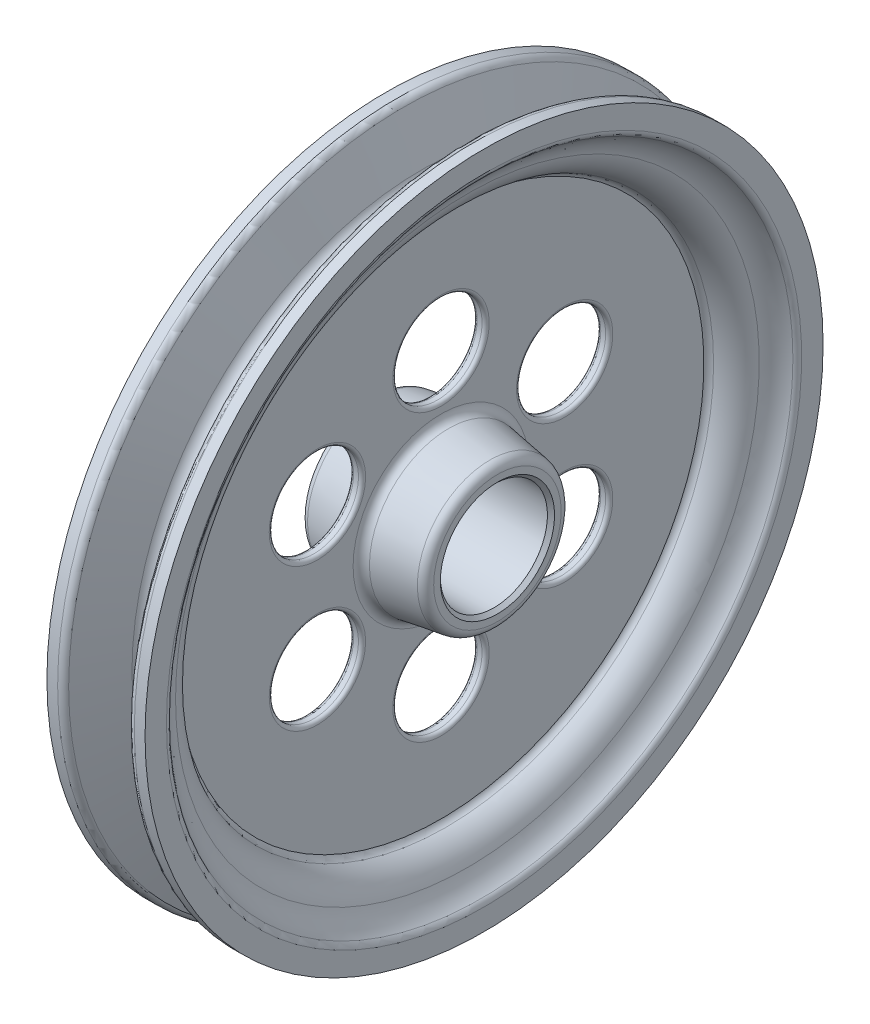
ISO-10303-21;
HEADER;
FILE_DESCRIPTION(('STEP AP214'),'2;1');
FILE_NAME('part.step','',(''),(''),'','','');
FILE_SCHEMA(('AUTOMOTIVE_DESIGN { 1 0 10303 214 1 1 1 1 }'));
ENDSEC;
DATA;
#1=APPLICATION_CONTEXT('core data for automotive mechanical design processes');
#2=APPLICATION_PROTOCOL_DEFINITION('international standard','automotive_design',2000,#1);
#3=PRODUCT_CONTEXT('',#1,'mechanical');
#4=PRODUCT('Part','Part','',(#3));
#5=PRODUCT_RELATED_PRODUCT_CATEGORY('part','',(#4));
#6=PRODUCT_DEFINITION_FORMATION('','',#4);
#7=PRODUCT_DEFINITION_CONTEXT('part definition',#1,'design');
#8=PRODUCT_DEFINITION('design','',#6,#7);
#9=PRODUCT_DEFINITION_SHAPE('','',#8);
#10=(LENGTH_UNIT() NAMED_UNIT(*) SI_UNIT(.MILLI.,.METRE.));
#11=(NAMED_UNIT(*) PLANE_ANGLE_UNIT() SI_UNIT($,.RADIAN.));
#12=(NAMED_UNIT(*) SI_UNIT($,.STERADIAN.) SOLID_ANGLE_UNIT());
#13=UNCERTAINTY_MEASURE_WITH_UNIT(LENGTH_MEASURE(1.E-05),#10,'distance_accuracy_value','');
#14=(GEOMETRIC_REPRESENTATION_CONTEXT(3) GLOBAL_UNCERTAINTY_ASSIGNED_CONTEXT((#13)) GLOBAL_UNIT_ASSIGNED_CONTEXT((#10,
#11,#12)) REPRESENTATION_CONTEXT('',''));
#15=CARTESIAN_POINT('',(0.,0.,0.));
#16=DIRECTION('',(0.,0.,1.));
#17=DIRECTION('',(1.,0.,0.));
#18=AXIS2_PLACEMENT_3D('',#15,#16,#17);
#19=CARTESIAN_POINT('',(3.375,49.2715916688331,0.));
#20=DIRECTION('',(-1.,0.,0.));
#21=DIRECTION('',(0.,0.,1.));
#22=AXIS2_PLACEMENT_3D('',#19,#20,#21);
#23=PLANE('',#22);
#24=CARTESIAN_POINT('',(3.375,40.0000000000039,-69.2820323027573));
#25=DIRECTION('',(-1.,0.,0.));
#26=DIRECTION('',(0.,0.,1.));
#27=AXIS2_PLACEMENT_3D('',#24,#25,#26);
#28=CIRCLE('',#27,27.0000000000012);
#29=CARTESIAN_POINT('',(3.375,40.0000000000039,-42.2820323027561));
#30=VERTEX_POINT('',#29);
#31=EDGE_CURVE('E87',#30,#30,#28,.T.);
#32=ORIENTED_EDGE('',*,*,#31,.T.);
#33=EDGE_LOOP('',(#32));
#34=FACE_BOUND('',#33,.T.);
#35=CARTESIAN_POINT('',(3.375,80.,0.));
#36=DIRECTION('',(-1.,0.,0.));
#37=DIRECTION('',(0.,0.,1.));
#38=AXIS2_PLACEMENT_3D('',#35,#36,#37);
#39=CIRCLE('',#38,27.);
#40=CARTESIAN_POINT('',(3.375,80.,27.));
#41=VERTEX_POINT('',#40);
#42=EDGE_CURVE('E90',#41,#41,#39,.T.);
#43=ORIENTED_EDGE('',*,*,#42,.T.);
#44=EDGE_LOOP('',(#43));
#45=FACE_BOUND('',#44,.T.);
#46=CARTESIAN_POINT('',(3.375,39.999999999996,69.2820323027529));
#47=DIRECTION('',(-1.,0.,0.));
#48=DIRECTION('',(0.,0.,1.));
#49=AXIS2_PLACEMENT_3D('',#46,#47,#48);
#50=CIRCLE('',#49,27.0000000000043);
#51=CARTESIAN_POINT('',(3.375,39.999999999996,96.2820323027571));
#52=VERTEX_POINT('',#51);
#53=EDGE_CURVE('E93',#52,#52,#50,.T.);
#54=ORIENTED_EDGE('',*,*,#53,.T.);
#55=EDGE_LOOP('',(#54));
#56=FACE_BOUND('',#55,.T.);
#57=CARTESIAN_POINT('',(3.375,-40.000000000004,69.2820323027483));
#58=DIRECTION('',(-1.,0.,0.));
#59=DIRECTION('',(0.,0.,1.));
#60=AXIS2_PLACEMENT_3D('',#57,#58,#59);
#61=CIRCLE('',#60,27.0000000000084);
#62=CARTESIAN_POINT('',(3.375,-40.000000000004,96.2820323027567));
#63=VERTEX_POINT('',#62);
#64=EDGE_CURVE('E96',#63,#63,#61,.T.);
#65=ORIENTED_EDGE('',*,*,#64,.T.);
#66=EDGE_LOOP('',(#65));
#67=FACE_BOUND('',#66,.T.);
#68=CARTESIAN_POINT('',(3.375,-80.,-9.07535266894292E-12));
#69=DIRECTION('',(-1.,0.,0.));
#70=DIRECTION('',(0.,0.,1.));
#71=AXIS2_PLACEMENT_3D('',#68,#69,#70);
#72=CIRCLE('',#71,27.0000000000092);
#73=CARTESIAN_POINT('',(3.375,-80.,27.0000000000001));
#74=VERTEX_POINT('',#73);
#75=EDGE_CURVE('E99',#74,#74,#72,.T.);
#76=ORIENTED_EDGE('',*,*,#75,.T.);
#77=EDGE_LOOP('',(#76));
#78=FACE_BOUND('',#77,.T.);
#79=CARTESIAN_POINT('',(3.375,-39.9999999999961,-69.2820323027619));
#80=DIRECTION('',(-1.,0.,0.));
#81=DIRECTION('',(0.,0.,1.));
#82=AXIS2_PLACEMENT_3D('',#79,#80,#81);
#83=CIRCLE('',#82,27.0000000000057);
#84=CARTESIAN_POINT('',(3.375,-39.9999999999961,-42.2820323027562));
#85=VERTEX_POINT('',#84);
#86=EDGE_CURVE('E102',#85,#85,#83,.T.);
#87=ORIENTED_EDGE('',*,*,#86,.T.);
#88=EDGE_LOOP('',(#87));
#89=FACE_BOUND('',#88,.T.);
#90=CARTESIAN_POINT('',(3.37499999999999,0.,0.));
#91=DIRECTION('',(-1.,0.,0.));
#92=DIRECTION('',(0.,0.,1.));
#93=AXIS2_PLACEMENT_3D('',#90,#91,#92);
#94=CIRCLE('',#93,147.322520830104);
#95=CARTESIAN_POINT('',(3.37499999999999,0.,147.322520830104));
#96=VERTEX_POINT('',#95);
#97=EDGE_CURVE('E123',#96,#96,#94,.T.);
#98=ORIENTED_EDGE('',*,*,#97,.F.);
#99=EDGE_LOOP('',(#98));
#100=FACE_BOUND('',#99,.T.);
#101=CARTESIAN_POINT('',(3.375,0.,0.));
#102=DIRECTION('',(-1.,0.,0.));
#103=DIRECTION('',(0.,0.,1.));
#104=AXIS2_PLACEMENT_3D('',#101,#102,#103);
#105=CIRCLE('',#104,49.2715916688331);
#106=CARTESIAN_POINT('',(3.375,0.,49.2715916688331));
#107=VERTEX_POINT('',#106);
#108=EDGE_CURVE('E120',#107,#107,#105,.T.);
#109=ORIENTED_EDGE('',*,*,#108,.T.);
#110=EDGE_LOOP('',(#109));
#111=FACE_BOUND('',#110,.T.);
#112=ADVANCED_FACE('F31',(#34,#45,#56,#67,#78,#89,#100,#111),#23,.F.);
#113=CARTESIAN_POINT('',(-3.375,49.2715916688331,0.));
#114=DIRECTION('',(1.,0.,0.));
#115=DIRECTION('',(0.,0.,-1.));
#116=AXIS2_PLACEMENT_3D('',#113,#114,#115);
#117=PLANE('',#116);
#118=CARTESIAN_POINT('',(-3.375,39.999999999996,69.2820323027529));
#119=DIRECTION('',(1.,0.,0.));
#120=DIRECTION('',(0.,0.,-1.));
#121=AXIS2_PLACEMENT_3D('',#118,#119,#120);
#122=CIRCLE('',#121,27.0000000000043);
#123=CARTESIAN_POINT('',(-3.375,39.999999999996,42.2820323027486));
#124=VERTEX_POINT('',#123);
#125=EDGE_CURVE('E10',#124,#124,#122,.T.);
#126=ORIENTED_EDGE('',*,*,#125,.T.);
#127=EDGE_LOOP('',(#126));
#128=FACE_BOUND('',#127,.T.);
#129=CARTESIAN_POINT('',(-3.375,-40.000000000004,69.2820323027483));
#130=DIRECTION('',(1.,0.,0.));
#131=DIRECTION('',(0.,0.,-1.));
#132=AXIS2_PLACEMENT_3D('',#129,#130,#131);
#133=CIRCLE('',#132,27.0000000000084);
#134=CARTESIAN_POINT('',(-3.375,-40.000000000004,42.2820323027399));
#135=VERTEX_POINT('',#134);
#136=EDGE_CURVE('E38',#135,#135,#133,.T.);
#137=ORIENTED_EDGE('',*,*,#136,.T.);
#138=EDGE_LOOP('',(#137));
#139=FACE_BOUND('',#138,.T.);
#140=CARTESIAN_POINT('',(-3.375,-80.,-9.07535266894292E-12));
#141=DIRECTION('',(1.,0.,0.));
#142=DIRECTION('',(0.,0.,-1.));
#143=AXIS2_PLACEMENT_3D('',#140,#141,#142);
#144=CIRCLE('',#143,27.0000000000092);
#145=CARTESIAN_POINT('',(-3.375,-80.,-27.0000000000183));
#146=VERTEX_POINT('',#145);
#147=EDGE_CURVE('E42',#146,#146,#144,.T.);
#148=ORIENTED_EDGE('',*,*,#147,.T.);
#149=EDGE_LOOP('',(#148));
#150=FACE_BOUND('',#149,.T.);
#151=CARTESIAN_POINT('',(-3.375,80.,0.));
#152=DIRECTION('',(1.,0.,0.));
#153=DIRECTION('',(0.,0.,-1.));
#154=AXIS2_PLACEMENT_3D('',#151,#152,#153);
#155=CIRCLE('',#154,27.);
#156=CARTESIAN_POINT('',(-3.375,80.,-27.));
#157=VERTEX_POINT('',#156);
#158=EDGE_CURVE('E46',#157,#157,#155,.T.);
#159=ORIENTED_EDGE('',*,*,#158,.T.);
#160=EDGE_LOOP('',(#159));
#161=FACE_BOUND('',#160,.T.);
#162=CARTESIAN_POINT('',(-3.375,40.0000000000039,-69.2820323027573));
#163=DIRECTION('',(1.,0.,0.));
#164=DIRECTION('',(0.,0.,-1.));
#165=AXIS2_PLACEMENT_3D('',#162,#163,#164);
#166=CIRCLE('',#165,27.0000000000012);
#167=CARTESIAN_POINT('',(-3.375,40.0000000000039,-96.2820323027586));
#168=VERTEX_POINT('',#167);
#169=EDGE_CURVE('E51',#168,#168,#166,.T.);
#170=ORIENTED_EDGE('',*,*,#169,.T.);
#171=EDGE_LOOP('',(#170));
#172=FACE_BOUND('',#171,.T.);
#173=CARTESIAN_POINT('',(-3.375,-39.9999999999961,-69.2820323027619));
#174=DIRECTION('',(1.,0.,0.));
#175=DIRECTION('',(0.,0.,-1.));
#176=AXIS2_PLACEMENT_3D('',#173,#174,#175);
#177=CIRCLE('',#176,27.0000000000057);
#178=CARTESIAN_POINT('',(-3.375,-39.9999999999961,-96.2820323027676));
#179=VERTEX_POINT('',#178);
#180=EDGE_CURVE('E54',#179,#179,#177,.T.);
#181=ORIENTED_EDGE('',*,*,#180,.T.);
#182=EDGE_LOOP('',(#181));
#183=FACE_BOUND('',#182,.T.);
#184=CARTESIAN_POINT('',(-3.375,0.,0.));
#185=DIRECTION('',(-1.,0.,0.));
#186=DIRECTION('',(0.,0.,1.));
#187=AXIS2_PLACEMENT_3D('',#184,#185,#186);
#188=CIRCLE('',#187,49.2715916688331);
#189=CARTESIAN_POINT('',(-3.375,0.,49.2715916688331));
#190=VERTEX_POINT('',#189);
#191=EDGE_CURVE('E177',#190,#190,#188,.T.);
#192=ORIENTED_EDGE('',*,*,#191,.F.);
#193=EDGE_LOOP('',(#192));
#194=FACE_BOUND('',#193,.T.);
#195=CARTESIAN_POINT('',(-3.375,0.,0.));
#196=DIRECTION('',(-1.,0.,0.));
#197=DIRECTION('',(0.,0.,1.));
#198=AXIS2_PLACEMENT_3D('',#195,#196,#197);
#199=CIRCLE('',#198,147.322520830104);
#200=CARTESIAN_POINT('',(-3.375,0.,147.322520830104));
#201=VERTEX_POINT('',#200);
#202=EDGE_CURVE('E174',#201,#201,#199,.T.);
#203=ORIENTED_EDGE('',*,*,#202,.T.);
#204=EDGE_LOOP('',(#203));
#205=FACE_BOUND('',#204,.T.);
#206=ADVANCED_FACE('F248',(#128,#139,#150,#161,#172,#183,#194,#205),#117,.F.);
#207=CARTESIAN_POINT('',(35.,32.,0.));
#208=DIRECTION('',(-1.,0.,0.));
#209=DIRECTION('',(0.,0.,1.));
#210=AXIS2_PLACEMENT_3D('',#207,#208,#209);
#211=PLANE('',#210);
#212=CARTESIAN_POINT('',(35.,0.,0.));
#213=DIRECTION('',(-1.,0.,0.));
#214=DIRECTION('',(0.,0.,1.));
#215=AXIS2_PLACEMENT_3D('',#212,#213,#214);
#216=CIRCLE('',#215,35.7284083311669);
#217=CARTESIAN_POINT('',(35.,0.,35.7284083311669));
#218=VERTEX_POINT('',#217);
#219=EDGE_CURVE('E111',#218,#218,#216,.T.);
#220=ORIENTED_EDGE('',*,*,#219,.F.);
#221=EDGE_LOOP('',(#220));
#222=FACE_BOUND('',#221,.T.);
#223=CARTESIAN_POINT('',(35.,0.,0.));
#224=DIRECTION('',(-1.,0.,0.));
#225=DIRECTION('',(0.,0.,1.));
#226=AXIS2_PLACEMENT_3D('',#223,#224,#225);
#227=CIRCLE('',#226,32.);
#228=CARTESIAN_POINT('',(35.,0.,32.));
#229=VERTEX_POINT('',#228);
#230=EDGE_CURVE('E198',#229,#229,#227,.T.);
#231=ORIENTED_EDGE('',*,*,#230,.T.);
#232=EDGE_LOOP('',(#231));
#233=FACE_BOUND('',#232,.T.);
#234=ADVANCED_FACE('F202',(#222,#233),#211,.F.);
#235=CARTESIAN_POINT('',(30.,0.,0.));
#236=DIRECTION('',(-1.,0.,0.));
#237=DIRECTION('',(0.,0.,1.));
#238=AXIS2_PLACEMENT_3D('',#235,#236,#237);
#239=TOROIDAL_SURFACE('',#238,35.7284083311669,5.);
#240=CARTESIAN_POINT('',(30.7808152492584,0.,0.));
#241=DIRECTION('',(-1.,0.,0.));
#242=DIRECTION('',(0.,0.,1.));
#243=AXIS2_PLACEMENT_3D('',#240,#241,#242);
#244=CIRCLE('',#243,40.667064782726);
#245=CARTESIAN_POINT('',(30.7808152492584,0.,40.667064782726));
#246=VERTEX_POINT('',#245);
#247=EDGE_CURVE('E114',#246,#246,#244,.T.);
#248=ORIENTED_EDGE('',*,*,#247,.F.);
#249=EDGE_LOOP('',(#248));
#250=FACE_BOUND('',#249,.T.);
#251=ORIENTED_EDGE('',*,*,#219,.T.);
#252=EDGE_LOOP('',(#251));
#253=FACE_BOUND('',#252,.T.);
#254=ADVANCED_FACE('F370',(#250,#253),#239,.T.);
#255=CARTESIAN_POINT('',(30.7808152492584,0.,0.));
#256=DIRECTION('',(-1.,0.,0.));
#257=DIRECTION('',(0.,0.,1.));
#258=AXIS2_PLACEMENT_3D('',#255,#256,#257);
#259=CONICAL_SURFACE('',#258,40.667064782726,0.156804840242877);
#260=CARTESIAN_POINT('',(7.59418475074165,0.,0.));
#261=DIRECTION('',(-1.,0.,0.));
#262=DIRECTION('',(0.,0.,1.));
#263=AXIS2_PLACEMENT_3D('',#260,#261,#262);
#264=CIRCLE('',#263,44.332935217274);
#265=CARTESIAN_POINT('',(7.59418475074165,0.,44.332935217274));
#266=VERTEX_POINT('',#265);
#267=EDGE_CURVE('E117',#266,#266,#264,.T.);
#268=ORIENTED_EDGE('',*,*,#267,.F.);
#269=EDGE_LOOP('',(#268));
#270=FACE_BOUND('',#269,.T.);
#271=ORIENTED_EDGE('',*,*,#247,.T.);
#272=EDGE_LOOP('',(#271));
#273=FACE_BOUND('',#272,.T.);
#274=ADVANCED_FACE('F364',(#270,#273),#259,.T.);
#275=CARTESIAN_POINT('',(8.375,0.,0.));
#276=DIRECTION('',(-1.,0.,0.));
#277=DIRECTION('',(0.,0.,1.));
#278=AXIS2_PLACEMENT_3D('',#275,#276,#277);
#279=TOROIDAL_SURFACE('',#278,49.2715916688331,5.);
#280=ORIENTED_EDGE('',*,*,#108,.F.);
#281=EDGE_LOOP('',(#280));
#282=FACE_BOUND('',#281,.T.);
#283=ORIENTED_EDGE('',*,*,#267,.T.);
#284=EDGE_LOOP('',(#283));
#285=FACE_BOUND('',#284,.T.);
#286=ADVANCED_FACE('F352',(#282,#285),#279,.F.);
#287=CARTESIAN_POINT('',(7.96893465106847,0.,0.));
#288=DIRECTION('',(-1.,0.,0.));
#289=DIRECTION('',(0.,0.,1.));
#290=AXIS2_PLACEMENT_3D('',#287,#288,#289);
#291=TOROIDAL_SURFACE('',#290,145.348751739832,5.00000000000001);
#292=CARTESIAN_POINT('',(6.13429855028778,0.,0.));
#293=DIRECTION('',(-1.,0.,0.));
#294=DIRECTION('',(0.,0.,1.));
#295=AXIS2_PLACEMENT_3D('',#292,#293,#294);
#296=CIRCLE('',#295,150.);
#297=CARTESIAN_POINT('',(6.13429855028778,0.,150.));
#298=VERTEX_POINT('',#297);
#299=EDGE_CURVE('E126',#298,#298,#296,.T.);
#300=ORIENTED_EDGE('',*,*,#299,.F.);
#301=EDGE_LOOP('',(#300));
#302=FACE_BOUND('',#301,.T.);
#303=ORIENTED_EDGE('',*,*,#97,.T.);
#304=EDGE_LOOP('',(#303));
#305=FACE_BOUND('',#304,.T.);
#306=ADVANCED_FACE('F346',(#302,#305),#291,.F.);
#307=CARTESIAN_POINT('',(-1.20424585283487,0.,0.));
#308=DIRECTION('',(-1.,0.,0.));
#309=DIRECTION('',(0.,0.,1.));
#310=AXIS2_PLACEMENT_3D('',#307,#308,#309);
#311=TOROIDAL_SURFACE('',#310,168.60499304067,20.);
#312=CARTESIAN_POINT('',(18.1478770735826,0.,0.));
#313=DIRECTION('',(-1.,0.,0.));
#314=DIRECTION('',(0.,0.,1.));
#315=AXIS2_PLACEMENT_3D('',#312,#313,#314);
#316=CIRCLE('',#315,163.555702175526);
#317=CARTESIAN_POINT('',(18.1478770735826,0.,163.555702175526));
#318=VERTEX_POINT('',#317);
#319=EDGE_CURVE('E129',#318,#318,#316,.T.);
#320=ORIENTED_EDGE('',*,*,#319,.F.);
#321=EDGE_LOOP('',(#320));
#322=FACE_BOUND('',#321,.T.);
#323=ORIENTED_EDGE('',*,*,#299,.T.);
#324=EDGE_LOOP('',(#323));
#325=FACE_BOUND('',#324,.T.);
#326=ADVANCED_FACE('F340',(#322,#325),#311,.T.);
#327=CARTESIAN_POINT('',(37.5,0.,0.));
#328=DIRECTION('',(-1.,0.,0.));
#329=DIRECTION('',(0.,0.,1.));
#330=AXIS2_PLACEMENT_3D('',#327,#328,#329);
#331=TOROIDAL_SURFACE('',#330,158.506411310382,20.);
#332=CARTESIAN_POINT('',(25.8333333333333,0.,0.));
#333=DIRECTION('',(-1.,0.,0.));
#334=DIRECTION('',(0.,0.,1.));
#335=AXIS2_PLACEMENT_3D('',#332,#333,#334);
#336=CIRCLE('',#335,174.75106855173);
#337=CARTESIAN_POINT('',(25.8333333333333,0.,174.75106855173));
#338=VERTEX_POINT('',#337);
#339=EDGE_CURVE('E132',#338,#338,#336,.T.);
#340=ORIENTED_EDGE('',*,*,#339,.F.);
#341=EDGE_LOOP('',(#340));
#342=FACE_BOUND('',#341,.T.);
#343=ORIENTED_EDGE('',*,*,#319,.T.);
#344=EDGE_LOOP('',(#343));
#345=FACE_BOUND('',#344,.T.);
#346=ADVANCED_FACE('F334',(#342,#345),#331,.F.);
#347=CARTESIAN_POINT('',(23.5,0.,0.));
#348=DIRECTION('',(-1.,0.,0.));
#349=DIRECTION('',(0.,0.,1.));
#350=AXIS2_PLACEMENT_3D('',#347,#348,#349);
#351=TOROIDAL_SURFACE('',#350,178.,3.99999999999999);
#352=CARTESIAN_POINT('',(27.5,0.,0.));
#353=DIRECTION('',(-1.,0.,0.));
#354=DIRECTION('',(0.,0.,1.));
#355=AXIS2_PLACEMENT_3D('',#352,#353,#354);
#356=CIRCLE('',#355,178.);
#357=CARTESIAN_POINT('',(27.5,0.,178.));
#358=VERTEX_POINT('',#357);
#359=EDGE_CURVE('E135',#358,#358,#356,.T.);
#360=ORIENTED_EDGE('',*,*,#359,.F.);
#361=EDGE_LOOP('',(#360));
#362=FACE_BOUND('',#361,.T.);
#363=ORIENTED_EDGE('',*,*,#339,.T.);
#364=EDGE_LOOP('',(#363));
#365=FACE_BOUND('',#364,.T.);
#366=ADVANCED_FACE('F328',(#362,#365),#351,.T.);
#367=CARTESIAN_POINT('',(27.5,178.,0.));
#368=DIRECTION('',(-1.,0.,0.));
#369=DIRECTION('',(0.,0.,1.));
#370=AXIS2_PLACEMENT_3D('',#367,#368,#369);
#371=PLANE('',#370);
#372=CARTESIAN_POINT('',(27.5,0.,0.));
#373=DIRECTION('',(-1.,0.,0.));
#374=DIRECTION('',(0.,0.,1.));
#375=AXIS2_PLACEMENT_3D('',#372,#373,#374);
#376=CIRCLE('',#375,190.);
#377=CARTESIAN_POINT('',(27.5,0.,190.));
#378=VERTEX_POINT('',#377);
#379=EDGE_CURVE('E138',#378,#378,#376,.T.);
#380=ORIENTED_EDGE('',*,*,#379,.F.);
#381=EDGE_LOOP('',(#380));
#382=FACE_BOUND('',#381,.T.);
#383=ORIENTED_EDGE('',*,*,#359,.T.);
#384=EDGE_LOOP('',(#383));
#385=FACE_BOUND('',#384,.T.);
#386=ADVANCED_FACE('F322',(#382,#385),#371,.F.);
#387=CARTESIAN_POINT('',(-94.4508605020689,0.,0.));
#388=DIRECTION('',(-1.,0.,0.));
#389=DIRECTION('',(0.,0.,1.));
#390=AXIS2_PLACEMENT_3D('',#387,#388,#389);
#391=CYLINDRICAL_SURFACE('',#390,190.);
#392=CARTESIAN_POINT('',(21.4800844321572,0.,0.));
#393=DIRECTION('',(-1.,0.,0.));
#394=DIRECTION('',(0.,0.,1.));
#395=AXIS2_PLACEMENT_3D('',#392,#393,#394);
#396=CIRCLE('',#395,190.);
#397=CARTESIAN_POINT('',(21.4800844321572,0.,190.));
#398=VERTEX_POINT('',#397);
#399=EDGE_CURVE('E141',#398,#398,#396,.T.);
#400=ORIENTED_EDGE('',*,*,#399,.F.);
#401=EDGE_LOOP('',(#400));
#402=FACE_BOUND('',#401,.T.);
#403=ORIENTED_EDGE('',*,*,#379,.T.);
#404=EDGE_LOOP('',(#403));
#405=FACE_BOUND('',#404,.T.);
#406=ADVANCED_FACE('F316',(#402,#405),#391,.T.);
#407=CARTESIAN_POINT('',(21.4800844321572,0.,0.));
#408=DIRECTION('',(-1.,0.,0.));
#409=DIRECTION('',(0.,0.,1.));
#410=AXIS2_PLACEMENT_3D('',#407,#408,#409);
#411=TOROIDAL_SURFACE('',#410,186.,4.);
#412=CARTESIAN_POINT('',(17.784566302112,0.,0.));
#413=DIRECTION('',(-1.,0.,0.));
#414=DIRECTION('',(0.,0.,1.));
#415=AXIS2_PLACEMENT_3D('',#412,#413,#414);
#416=CIRCLE('',#415,187.53073372946);
#417=CARTESIAN_POINT('',(17.784566302112,0.,187.53073372946));
#418=VERTEX_POINT('',#417);
#419=EDGE_CURVE('E144',#418,#418,#416,.T.);
#420=ORIENTED_EDGE('',*,*,#419,.F.);
#421=EDGE_LOOP('',(#420));
#422=FACE_BOUND('',#421,.T.);
#423=ORIENTED_EDGE('',*,*,#399,.T.);
#424=EDGE_LOOP('',(#423));
#425=FACE_BOUND('',#424,.T.);
#426=ADVANCED_FACE('F310',(#422,#425),#411,.T.);
#427=CARTESIAN_POINT('',(17.784566302112,0.,0.));
#428=DIRECTION('',(1.,0.,0.));
#429=DIRECTION('',(0.,0.,-1.));
#430=AXIS2_PLACEMENT_3D('',#427,#428,#429);
#431=CONICAL_SURFACE('',#430,187.53073372946,1.17809724509617);
#432=CARTESIAN_POINT('',(7.3910362600903,0.,0.));
#433=DIRECTION('',(-1.,0.,0.));
#434=DIRECTION('',(0.,0.,1.));
#435=AXIS2_PLACEMENT_3D('',#432,#433,#434);
#436=CIRCLE('',#435,162.438532541079);
#437=CARTESIAN_POINT('',(7.3910362600903,0.,162.438532541079));
#438=VERTEX_POINT('',#437);
#439=EDGE_CURVE('E147',#438,#438,#436,.T.);
#440=ORIENTED_EDGE('',*,*,#439,.F.);
#441=EDGE_LOOP('',(#440));
#442=FACE_BOUND('',#441,.T.);
#443=ORIENTED_EDGE('',*,*,#419,.T.);
#444=EDGE_LOOP('',(#443));
#445=FACE_BOUND('',#444,.T.);
#446=ADVANCED_FACE('F304',(#442,#445),#431,.T.);
#447=CARTESIAN_POINT('',(0.,0.,0.));
#448=DIRECTION('',(-1.,0.,0.));
#449=DIRECTION('',(0.,0.,1.));
#450=AXIS2_PLACEMENT_3D('',#447,#448,#449);
#451=TOROIDAL_SURFACE('',#450,165.5,8.00000000000001);
#452=CARTESIAN_POINT('',(-7.3910362600903,0.,0.));
#453=DIRECTION('',(-1.,0.,0.));
#454=DIRECTION('',(0.,0.,1.));
#455=AXIS2_PLACEMENT_3D('',#452,#453,#454);
#456=CIRCLE('',#455,162.438532541079);
#457=CARTESIAN_POINT('',(-7.3910362600903,0.,162.438532541079));
#458=VERTEX_POINT('',#457);
#459=EDGE_CURVE('E150',#458,#458,#456,.T.);
#460=ORIENTED_EDGE('',*,*,#459,.F.);
#461=EDGE_LOOP('',(#460));
#462=FACE_BOUND('',#461,.T.);
#463=ORIENTED_EDGE('',*,*,#439,.T.);
#464=EDGE_LOOP('',(#463));
#465=FACE_BOUND('',#464,.T.);
#466=ADVANCED_FACE('F298',(#462,#465),#451,.F.);
#467=CARTESIAN_POINT('',(-7.3910362600903,0.,0.));
#468=DIRECTION('',(-1.,0.,0.));
#469=DIRECTION('',(0.,0.,1.));
#470=AXIS2_PLACEMENT_3D('',#467,#468,#469);
#471=CONICAL_SURFACE('',#470,162.438532541079,1.17809724509617);
#472=CARTESIAN_POINT('',(-17.784566302112,0.,0.));
#473=DIRECTION('',(-1.,0.,0.));
#474=DIRECTION('',(0.,0.,1.));
#475=AXIS2_PLACEMENT_3D('',#472,#473,#474);
#476=CIRCLE('',#475,187.53073372946);
#477=CARTESIAN_POINT('',(-17.784566302112,0.,187.53073372946));
#478=VERTEX_POINT('',#477);
#479=EDGE_CURVE('E153',#478,#478,#476,.T.);
#480=ORIENTED_EDGE('',*,*,#479,.F.);
#481=EDGE_LOOP('',(#480));
#482=FACE_BOUND('',#481,.T.);
#483=ORIENTED_EDGE('',*,*,#459,.T.);
#484=EDGE_LOOP('',(#483));
#485=FACE_BOUND('',#484,.T.);
#486=ADVANCED_FACE('F292',(#482,#485),#471,.T.);
#487=CARTESIAN_POINT('',(-21.4800844321572,0.,0.));
#488=DIRECTION('',(-1.,0.,0.));
#489=DIRECTION('',(0.,0.,1.));
#490=AXIS2_PLACEMENT_3D('',#487,#488,#489);
#491=TOROIDAL_SURFACE('',#490,186.,4.);
#492=CARTESIAN_POINT('',(-21.4800844321572,0.,0.));
#493=DIRECTION('',(-1.,0.,0.));
#494=DIRECTION('',(0.,0.,1.));
#495=AXIS2_PLACEMENT_3D('',#492,#493,#494);
#496=CIRCLE('',#495,190.);
#497=CARTESIAN_POINT('',(-21.4800844321572,0.,190.));
#498=VERTEX_POINT('',#497);
#499=EDGE_CURVE('E156',#498,#498,#496,.T.);
#500=ORIENTED_EDGE('',*,*,#499,.F.);
#501=EDGE_LOOP('',(#500));
#502=FACE_BOUND('',#501,.T.);
#503=ORIENTED_EDGE('',*,*,#479,.T.);
#504=EDGE_LOOP('',(#503));
#505=FACE_BOUND('',#504,.T.);
#506=ADVANCED_FACE('F286',(#502,#505),#491,.T.);
#507=CARTESIAN_POINT('',(-94.4508605020689,0.,0.));
#508=DIRECTION('',(-1.,0.,0.));
#509=DIRECTION('',(0.,0.,1.));
#510=AXIS2_PLACEMENT_3D('',#507,#508,#509);
#511=CYLINDRICAL_SURFACE('',#510,190.);
#512=CARTESIAN_POINT('',(-27.5,0.,0.));
#513=DIRECTION('',(-1.,0.,0.));
#514=DIRECTION('',(0.,0.,1.));
#515=AXIS2_PLACEMENT_3D('',#512,#513,#514);
#516=CIRCLE('',#515,190.);
#517=CARTESIAN_POINT('',(-27.5,0.,190.));
#518=VERTEX_POINT('',#517);
#519=EDGE_CURVE('E159',#518,#518,#516,.T.);
#520=ORIENTED_EDGE('',*,*,#519,.F.);
#521=EDGE_LOOP('',(#520));
#522=FACE_BOUND('',#521,.T.);
#523=ORIENTED_EDGE('',*,*,#499,.T.);
#524=EDGE_LOOP('',(#523));
#525=FACE_BOUND('',#524,.T.);
#526=ADVANCED_FACE('F280',(#522,#525),#511,.T.);
#527=CARTESIAN_POINT('',(-27.5,178.,0.));
#528=DIRECTION('',(1.,0.,0.));
#529=DIRECTION('',(0.,0.,-1.));
#530=AXIS2_PLACEMENT_3D('',#527,#528,#529);
#531=PLANE('',#530);
#532=CARTESIAN_POINT('',(-27.5,0.,0.));
#533=DIRECTION('',(-1.,0.,0.));
#534=DIRECTION('',(0.,0.,1.));
#535=AXIS2_PLACEMENT_3D('',#532,#533,#534);
#536=CIRCLE('',#535,178.);
#537=CARTESIAN_POINT('',(-27.5,0.,178.));
#538=VERTEX_POINT('',#537);
#539=EDGE_CURVE('E162',#538,#538,#536,.T.);
#540=ORIENTED_EDGE('',*,*,#539,.F.);
#541=EDGE_LOOP('',(#540));
#542=FACE_BOUND('',#541,.T.);
#543=ORIENTED_EDGE('',*,*,#519,.T.);
#544=EDGE_LOOP('',(#543));
#545=FACE_BOUND('',#544,.T.);
#546=ADVANCED_FACE('F274',(#542,#545),#531,.F.);
#547=CARTESIAN_POINT('',(-23.5,0.,0.));
#548=DIRECTION('',(-1.,0.,0.));
#549=DIRECTION('',(0.,0.,1.));
#550=AXIS2_PLACEMENT_3D('',#547,#548,#549);
#551=TOROIDAL_SURFACE('',#550,178.,3.99999999999999);
#552=CARTESIAN_POINT('',(-25.8333333333333,0.,0.));
#553=DIRECTION('',(-1.,0.,0.));
#554=DIRECTION('',(0.,0.,1.));
#555=AXIS2_PLACEMENT_3D('',#552,#553,#554);
#556=CIRCLE('',#555,174.75106855173);
#557=CARTESIAN_POINT('',(-25.8333333333333,0.,174.75106855173));
#558=VERTEX_POINT('',#557);
#559=EDGE_CURVE('E165',#558,#558,#556,.T.);
#560=ORIENTED_EDGE('',*,*,#559,.F.);
#561=EDGE_LOOP('',(#560));
#562=FACE_BOUND('',#561,.T.);
#563=ORIENTED_EDGE('',*,*,#539,.T.);
#564=EDGE_LOOP('',(#563));
#565=FACE_BOUND('',#564,.T.);
#566=ADVANCED_FACE('F268',(#562,#565),#551,.T.);
#567=CARTESIAN_POINT('',(-37.5,0.,0.));
#568=DIRECTION('',(-1.,0.,0.));
#569=DIRECTION('',(0.,0.,1.));
#570=AXIS2_PLACEMENT_3D('',#567,#568,#569);
#571=TOROIDAL_SURFACE('',#570,158.506411310382,20.);
#572=CARTESIAN_POINT('',(-18.1478770735826,0.,0.));
#573=DIRECTION('',(-1.,0.,0.));
#574=DIRECTION('',(0.,0.,1.));
#575=AXIS2_PLACEMENT_3D('',#572,#573,#574);
#576=CIRCLE('',#575,163.555702175526);
#577=CARTESIAN_POINT('',(-18.1478770735826,0.,163.555702175526));
#578=VERTEX_POINT('',#577);
#579=EDGE_CURVE('E168',#578,#578,#576,.T.);
#580=ORIENTED_EDGE('',*,*,#579,.F.);
#581=EDGE_LOOP('',(#580));
#582=FACE_BOUND('',#581,.T.);
#583=ORIENTED_EDGE('',*,*,#559,.T.);
#584=EDGE_LOOP('',(#583));
#585=FACE_BOUND('',#584,.T.);
#586=ADVANCED_FACE('F262',(#582,#585),#571,.F.);
#587=CARTESIAN_POINT('',(1.20424585283487,0.,0.));
#588=DIRECTION('',(-1.,0.,0.));
#589=DIRECTION('',(0.,0.,1.));
#590=AXIS2_PLACEMENT_3D('',#587,#588,#589);
#591=TOROIDAL_SURFACE('',#590,168.60499304067,20.);
#592=CARTESIAN_POINT('',(-6.13429855028781,0.,0.));
#593=DIRECTION('',(-1.,0.,0.));
#594=DIRECTION('',(0.,0.,1.));
#595=AXIS2_PLACEMENT_3D('',#592,#593,#594);
#596=CIRCLE('',#595,150.);
#597=CARTESIAN_POINT('',(-6.13429855028781,0.,150.));
#598=VERTEX_POINT('',#597);
#599=EDGE_CURVE('E171',#598,#598,#596,.T.);
#600=ORIENTED_EDGE('',*,*,#599,.F.);
#601=EDGE_LOOP('',(#600));
#602=FACE_BOUND('',#601,.T.);
#603=ORIENTED_EDGE('',*,*,#579,.T.);
#604=EDGE_LOOP('',(#603));
#605=FACE_BOUND('',#604,.T.);
#606=ADVANCED_FACE('F256',(#602,#605),#591,.T.);
#607=CARTESIAN_POINT('',(-7.96893465106847,0.,0.));
#608=DIRECTION('',(-1.,0.,0.));
#609=DIRECTION('',(0.,0.,1.));
#610=AXIS2_PLACEMENT_3D('',#607,#608,#609);
#611=TOROIDAL_SURFACE('',#610,145.348751739832,5.00000000000001);
#612=ORIENTED_EDGE('',*,*,#202,.F.);
#613=EDGE_LOOP('',(#612));
#614=FACE_BOUND('',#613,.T.);
#615=ORIENTED_EDGE('',*,*,#599,.T.);
#616=EDGE_LOOP('',(#615));
#617=FACE_BOUND('',#616,.T.);
#618=ADVANCED_FACE('F244',(#614,#617),#611,.F.);
#619=CARTESIAN_POINT('',(-8.375,0.,0.));
#620=DIRECTION('',(-1.,0.,0.));
#621=DIRECTION('',(0.,0.,1.));
#622=AXIS2_PLACEMENT_3D('',#619,#620,#621);
#623=TOROIDAL_SURFACE('',#622,49.2715916688331,5.);
#624=CARTESIAN_POINT('',(-7.59418475074165,0.,0.));
#625=DIRECTION('',(-1.,0.,0.));
#626=DIRECTION('',(0.,0.,1.));
#627=AXIS2_PLACEMENT_3D('',#624,#625,#626);
#628=CIRCLE('',#627,44.332935217274);
#629=CARTESIAN_POINT('',(-7.59418475074165,0.,44.332935217274));
#630=VERTEX_POINT('',#629);
#631=EDGE_CURVE('E180',#630,#630,#628,.T.);
#632=ORIENTED_EDGE('',*,*,#631,.F.);
#633=EDGE_LOOP('',(#632));
#634=FACE_BOUND('',#633,.T.);
#635=ORIENTED_EDGE('',*,*,#191,.T.);
#636=EDGE_LOOP('',(#635));
#637=FACE_BOUND('',#636,.T.);
#638=ADVANCED_FACE('F238',(#634,#637),#623,.F.);
#639=CARTESIAN_POINT('',(-7.59418475074165,0.,0.));
#640=DIRECTION('',(1.,0.,0.));
#641=DIRECTION('',(0.,0.,-1.));
#642=AXIS2_PLACEMENT_3D('',#639,#640,#641);
#643=CONICAL_SURFACE('',#642,44.332935217274,0.156804840242878);
#644=CARTESIAN_POINT('',(-30.7808152492584,0.,0.));
#645=DIRECTION('',(-1.,0.,0.));
#646=DIRECTION('',(0.,0.,1.));
#647=AXIS2_PLACEMENT_3D('',#644,#645,#646);
#648=CIRCLE('',#647,40.667064782726);
#649=CARTESIAN_POINT('',(-30.7808152492584,0.,40.667064782726));
#650=VERTEX_POINT('',#649);
#651=EDGE_CURVE('E183',#650,#650,#648,.T.);
#652=ORIENTED_EDGE('',*,*,#651,.F.);
#653=EDGE_LOOP('',(#652));
#654=FACE_BOUND('',#653,.T.);
#655=ORIENTED_EDGE('',*,*,#631,.T.);
#656=EDGE_LOOP('',(#655));
#657=FACE_BOUND('',#656,.T.);
#658=ADVANCED_FACE('F232',(#654,#657),#643,.T.);
#659=CARTESIAN_POINT('',(-30.,0.,0.));
#660=DIRECTION('',(-1.,0.,0.));
#661=DIRECTION('',(0.,0.,1.));
#662=AXIS2_PLACEMENT_3D('',#659,#660,#661);
#663=TOROIDAL_SURFACE('',#662,35.7284083311669,5.);
#664=CARTESIAN_POINT('',(-35.,0.,0.));
#665=DIRECTION('',(-1.,0.,0.));
#666=DIRECTION('',(0.,0.,1.));
#667=AXIS2_PLACEMENT_3D('',#664,#665,#666);
#668=CIRCLE('',#667,35.7284083311669);
#669=CARTESIAN_POINT('',(-35.,0.,35.7284083311669));
#670=VERTEX_POINT('',#669);
#671=EDGE_CURVE('E186',#670,#670,#668,.T.);
#672=ORIENTED_EDGE('',*,*,#671,.F.);
#673=EDGE_LOOP('',(#672));
#674=FACE_BOUND('',#673,.T.);
#675=ORIENTED_EDGE('',*,*,#651,.T.);
#676=EDGE_LOOP('',(#675));
#677=FACE_BOUND('',#676,.T.);
#678=ADVANCED_FACE('F226',(#674,#677),#663,.T.);
#679=CARTESIAN_POINT('',(-35.,32.,0.));
#680=DIRECTION('',(1.,0.,0.));
#681=DIRECTION('',(0.,0.,-1.));
#682=AXIS2_PLACEMENT_3D('',#679,#680,#681);
#683=PLANE('',#682);
#684=CARTESIAN_POINT('',(-35.,0.,0.));
#685=DIRECTION('',(-1.,0.,0.));
#686=DIRECTION('',(0.,0.,1.));
#687=AXIS2_PLACEMENT_3D('',#684,#685,#686);
#688=CIRCLE('',#687,32.);
#689=CARTESIAN_POINT('',(-35.,0.,32.));
#690=VERTEX_POINT('',#689);
#691=EDGE_CURVE('E189',#690,#690,#688,.T.);
#692=ORIENTED_EDGE('',*,*,#691,.F.);
#693=EDGE_LOOP('',(#692));
#694=FACE_BOUND('',#693,.T.);
#695=ORIENTED_EDGE('',*,*,#671,.T.);
#696=EDGE_LOOP('',(#695));
#697=FACE_BOUND('',#696,.T.);
#698=ADVANCED_FACE('F220',(#694,#697),#683,.F.);
#699=CARTESIAN_POINT('',(-35.,0.,0.));
#700=DIRECTION('',(-1.,0.,0.));
#701=DIRECTION('',(0.,0.,1.));
#702=AXIS2_PLACEMENT_3D('',#699,#700,#701);
#703=CONICAL_SURFACE('',#702,32.,0.785398163397447);
#704=CARTESIAN_POINT('',(-33.,0.,0.));
#705=DIRECTION('',(-1.,0.,0.));
#706=DIRECTION('',(0.,0.,1.));
#707=AXIS2_PLACEMENT_3D('',#704,#705,#706);
#708=CIRCLE('',#707,30.);
#709=CARTESIAN_POINT('',(-33.,0.,30.));
#710=VERTEX_POINT('',#709);
#711=EDGE_CURVE('E192',#710,#710,#708,.T.);
#712=ORIENTED_EDGE('',*,*,#711,.F.);
#713=EDGE_LOOP('',(#712));
#714=FACE_BOUND('',#713,.T.);
#715=ORIENTED_EDGE('',*,*,#691,.T.);
#716=EDGE_LOOP('',(#715));
#717=FACE_BOUND('',#716,.T.);
#718=ADVANCED_FACE('F214',(#714,#717),#703,.F.);
#719=CARTESIAN_POINT('',(-94.4508605020689,0.,0.));
#720=DIRECTION('',(-1.,0.,0.));
#721=DIRECTION('',(0.,0.,1.));
#722=AXIS2_PLACEMENT_3D('',#719,#720,#721);
#723=CYLINDRICAL_SURFACE('',#722,30.);
#724=CARTESIAN_POINT('',(33.,0.,0.));
#725=DIRECTION('',(-1.,0.,0.));
#726=DIRECTION('',(0.,0.,1.));
#727=AXIS2_PLACEMENT_3D('',#724,#725,#726);
#728=CIRCLE('',#727,30.);
#729=CARTESIAN_POINT('',(33.,0.,30.));
#730=VERTEX_POINT('',#729);
#731=EDGE_CURVE('E195',#730,#730,#728,.T.);
#732=ORIENTED_EDGE('',*,*,#731,.F.);
#733=EDGE_LOOP('',(#732));
#734=FACE_BOUND('',#733,.T.);
#735=ORIENTED_EDGE('',*,*,#711,.T.);
#736=EDGE_LOOP('',(#735));
#737=FACE_BOUND('',#736,.T.);
#738=ADVANCED_FACE('F208',(#734,#737),#723,.F.);
#739=CARTESIAN_POINT('',(33.,0.,0.));
#740=DIRECTION('',(1.,0.,0.));
#741=DIRECTION('',(0.,0.,-1.));
#742=AXIS2_PLACEMENT_3D('',#739,#740,#741);
#743=CONICAL_SURFACE('',#742,30.,0.785398163397447);
#744=ORIENTED_EDGE('',*,*,#230,.F.);
#745=EDGE_LOOP('',(#744));
#746=FACE_BOUND('',#745,.T.);
#747=ORIENTED_EDGE('',*,*,#731,.T.);
#748=EDGE_LOOP('',(#747));
#749=FACE_BOUND('',#748,.T.);
#750=ADVANCED_FACE('F204',(#746,#749),#743,.F.);
#751=CARTESIAN_POINT('',(5.,80.,0.));
#752=DIRECTION('',(-1.,0.,0.));
#753=DIRECTION('',(0.,0.,1.));
#754=AXIS2_PLACEMENT_3D('',#751,#752,#753);
#755=CYLINDRICAL_SURFACE('',#754,25.);
#756=CARTESIAN_POINT('',(1.375,80.,0.));
#757=DIRECTION('',(-1.,0.,0.));
#758=DIRECTION('',(0.,0.,1.));
#759=AXIS2_PLACEMENT_3D('',#756,#757,#758);
#760=CIRCLE('',#759,25.);
#761=CARTESIAN_POINT('',(1.375,80.,25.));
#762=VERTEX_POINT('',#761);
#763=EDGE_CURVE('E81',#762,#762,#760,.F.);
#764=ORIENTED_EDGE('',*,*,#763,.T.);
#765=EDGE_LOOP('',(#764));
#766=FACE_BOUND('',#765,.T.);
#767=CARTESIAN_POINT('',(-1.375,80.,0.));
#768=DIRECTION('',(1.,0.,0.));
#769=DIRECTION('',(0.,0.,-1.));
#770=AXIS2_PLACEMENT_3D('',#767,#768,#769);
#771=CIRCLE('',#770,25.);
#772=CARTESIAN_POINT('',(-1.375,80.,-25.));
#773=VERTEX_POINT('',#772);
#774=EDGE_CURVE('E84',#773,#773,#771,.F.);
#775=ORIENTED_EDGE('',*,*,#774,.T.);
#776=EDGE_LOOP('',(#775));
#777=FACE_BOUND('',#776,.T.);
#778=ADVANCED_FACE('F207',(#766,#777),#755,.F.);
#779=CARTESIAN_POINT('',(5.,40.0000000000039,-69.2820323027573));
#780=DIRECTION('',(-1.,0.,0.));
#781=DIRECTION('',(0.,0.,1.));
#782=AXIS2_PLACEMENT_3D('',#779,#780,#781);
#783=CYLINDRICAL_SURFACE('',#782,25.0000000000012);
#784=CARTESIAN_POINT('',(1.375,40.0000000000039,-69.2820323027573));
#785=DIRECTION('',(-1.,0.,0.));
#786=DIRECTION('',(0.,0.,1.));
#787=AXIS2_PLACEMENT_3D('',#784,#785,#786);
#788=CIRCLE('',#787,25.0000000000012);
#789=CARTESIAN_POINT('',(1.375,40.0000000000039,-44.2820323027561));
#790=VERTEX_POINT('',#789);
#791=EDGE_CURVE('E105',#790,#790,#788,.F.);
#792=ORIENTED_EDGE('',*,*,#791,.T.);
#793=EDGE_LOOP('',(#792));
#794=FACE_BOUND('',#793,.T.);
#795=CARTESIAN_POINT('',(-1.375,40.0000000000039,-69.2820323027573));
#796=DIRECTION('',(1.,0.,0.));
#797=DIRECTION('',(0.,0.,-1.));
#798=AXIS2_PLACEMENT_3D('',#795,#796,#797);
#799=CIRCLE('',#798,25.0000000000012);
#800=CARTESIAN_POINT('',(-1.375,40.0000000000039,-94.2820323027586));
#801=VERTEX_POINT('',#800);
#802=EDGE_CURVE('E108',#801,#801,#799,.F.);
#803=ORIENTED_EDGE('',*,*,#802,.T.);
#804=EDGE_LOOP('',(#803));
#805=FACE_BOUND('',#804,.T.);
#806=ADVANCED_FACE('F435',(#794,#805),#783,.F.);
#807=CARTESIAN_POINT('',(5.,-39.9999999999961,-69.2820323027619));
#808=DIRECTION('',(-1.,0.,0.));
#809=DIRECTION('',(0.,0.,1.));
#810=AXIS2_PLACEMENT_3D('',#807,#808,#809);
#811=CYLINDRICAL_SURFACE('',#810,25.0000000000057);
#812=CARTESIAN_POINT('',(1.375,-39.9999999999961,-69.2820323027619));
#813=DIRECTION('',(-1.,0.,0.));
#814=DIRECTION('',(0.,0.,1.));
#815=AXIS2_PLACEMENT_3D('',#812,#813,#814);
#816=CIRCLE('',#815,25.0000000000057);
#817=CARTESIAN_POINT('',(1.375,-39.9999999999961,-44.2820323027562));
#818=VERTEX_POINT('',#817);
#819=EDGE_CURVE('E57',#818,#818,#816,.F.);
#820=ORIENTED_EDGE('',*,*,#819,.T.);
#821=EDGE_LOOP('',(#820));
#822=FACE_BOUND('',#821,.T.);
#823=CARTESIAN_POINT('',(-1.375,-39.9999999999961,-69.2820323027619));
#824=DIRECTION('',(1.,0.,0.));
#825=DIRECTION('',(0.,0.,-1.));
#826=AXIS2_PLACEMENT_3D('',#823,#824,#825);
#827=CIRCLE('',#826,25.0000000000057);
#828=CARTESIAN_POINT('',(-1.375,-39.9999999999961,-94.2820323027676));
#829=VERTEX_POINT('',#828);
#830=EDGE_CURVE('E60',#829,#829,#827,.F.);
#831=ORIENTED_EDGE('',*,*,#830,.T.);
#832=EDGE_LOOP('',(#831));
#833=FACE_BOUND('',#832,.T.);
#834=ADVANCED_FACE('F437',(#822,#833),#811,.F.);
#835=CARTESIAN_POINT('',(5.,-80.,-9.07535266894292E-12));
#836=DIRECTION('',(-1.,0.,0.));
#837=DIRECTION('',(0.,0.,1.));
#838=AXIS2_PLACEMENT_3D('',#835,#836,#837);
#839=CYLINDRICAL_SURFACE('',#838,25.0000000000092);
#840=CARTESIAN_POINT('',(1.375,-80.,-9.07535266894292E-12));
#841=DIRECTION('',(-1.,0.,0.));
#842=DIRECTION('',(0.,0.,1.));
#843=AXIS2_PLACEMENT_3D('',#840,#841,#842);
#844=CIRCLE('',#843,25.0000000000092);
#845=CARTESIAN_POINT('',(1.375,-80.,25.0000000000001));
#846=VERTEX_POINT('',#845);
#847=EDGE_CURVE('E63',#846,#846,#844,.F.);
#848=ORIENTED_EDGE('',*,*,#847,.T.);
#849=EDGE_LOOP('',(#848));
#850=FACE_BOUND('',#849,.T.);
#851=CARTESIAN_POINT('',(-1.375,-80.,-9.07535266894292E-12));
#852=DIRECTION('',(1.,0.,0.));
#853=DIRECTION('',(0.,0.,-1.));
#854=AXIS2_PLACEMENT_3D('',#851,#852,#853);
#855=CIRCLE('',#854,25.0000000000092);
#856=CARTESIAN_POINT('',(-1.375,-80.,-25.0000000000183));
#857=VERTEX_POINT('',#856);
#858=EDGE_CURVE('E66',#857,#857,#855,.F.);
#859=ORIENTED_EDGE('',*,*,#858,.T.);
#860=EDGE_LOOP('',(#859));
#861=FACE_BOUND('',#860,.T.);
#862=ADVANCED_FACE('F444',(#850,#861),#839,.F.);
#863=CARTESIAN_POINT('',(5.,-40.000000000004,69.2820323027483));
#864=DIRECTION('',(-1.,0.,0.));
#865=DIRECTION('',(0.,0.,1.));
#866=AXIS2_PLACEMENT_3D('',#863,#864,#865);
#867=CYLINDRICAL_SURFACE('',#866,25.0000000000084);
#868=CARTESIAN_POINT('',(1.375,-40.000000000004,69.2820323027483));
#869=DIRECTION('',(-1.,0.,0.));
#870=DIRECTION('',(0.,0.,1.));
#871=AXIS2_PLACEMENT_3D('',#868,#869,#870);
#872=CIRCLE('',#871,25.0000000000084);
#873=CARTESIAN_POINT('',(1.375,-40.000000000004,94.2820323027567));
#874=VERTEX_POINT('',#873);
#875=EDGE_CURVE('E69',#874,#874,#872,.F.);
#876=ORIENTED_EDGE('',*,*,#875,.T.);
#877=EDGE_LOOP('',(#876));
#878=FACE_BOUND('',#877,.T.);
#879=CARTESIAN_POINT('',(-1.375,-40.000000000004,69.2820323027483));
#880=DIRECTION('',(1.,0.,0.));
#881=DIRECTION('',(0.,0.,-1.));
#882=AXIS2_PLACEMENT_3D('',#879,#880,#881);
#883=CIRCLE('',#882,25.0000000000084);
#884=CARTESIAN_POINT('',(-1.375,-40.000000000004,44.2820323027399));
#885=VERTEX_POINT('',#884);
#886=EDGE_CURVE('E72',#885,#885,#883,.F.);
#887=ORIENTED_EDGE('',*,*,#886,.T.);
#888=EDGE_LOOP('',(#887));
#889=FACE_BOUND('',#888,.T.);
#890=ADVANCED_FACE('F452',(#878,#889),#867,.F.);
#891=CARTESIAN_POINT('',(5.,39.999999999996,69.2820323027529));
#892=DIRECTION('',(-1.,0.,0.));
#893=DIRECTION('',(0.,0.,1.));
#894=AXIS2_PLACEMENT_3D('',#891,#892,#893);
#895=CYLINDRICAL_SURFACE('',#894,25.0000000000043);
#896=CARTESIAN_POINT('',(1.375,39.999999999996,69.2820323027529));
#897=DIRECTION('',(-1.,0.,0.));
#898=DIRECTION('',(0.,0.,1.));
#899=AXIS2_PLACEMENT_3D('',#896,#897,#898);
#900=CIRCLE('',#899,25.0000000000043);
#901=CARTESIAN_POINT('',(1.375,39.999999999996,94.2820323027571));
#902=VERTEX_POINT('',#901);
#903=EDGE_CURVE('E75',#902,#902,#900,.F.);
#904=ORIENTED_EDGE('',*,*,#903,.T.);
#905=EDGE_LOOP('',(#904));
#906=FACE_BOUND('',#905,.T.);
#907=CARTESIAN_POINT('',(-1.375,39.999999999996,69.2820323027529));
#908=DIRECTION('',(1.,0.,0.));
#909=DIRECTION('',(0.,0.,-1.));
#910=AXIS2_PLACEMENT_3D('',#907,#908,#909);
#911=CIRCLE('',#910,25.0000000000043);
#912=CARTESIAN_POINT('',(-1.375,39.999999999996,44.2820323027486));
#913=VERTEX_POINT('',#912);
#914=EDGE_CURVE('E78',#913,#913,#911,.F.);
#915=ORIENTED_EDGE('',*,*,#914,.T.);
#916=EDGE_LOOP('',(#915));
#917=FACE_BOUND('',#916,.T.);
#918=ADVANCED_FACE('F388',(#906,#917),#895,.F.);
#919=CARTESIAN_POINT('',(1.375,40.0000000000039,-69.2820323027573));
#920=DIRECTION('',(-1.,0.,0.));
#921=DIRECTION('',(0.,0.,1.));
#922=AXIS2_PLACEMENT_3D('',#919,#920,#921);
#923=TOROIDAL_SURFACE('',#922,27.0000000000012,2.);
#924=ORIENTED_EDGE('',*,*,#31,.F.);
#925=EDGE_LOOP('',(#924));
#926=FACE_BOUND('',#925,.T.);
#927=ORIENTED_EDGE('',*,*,#791,.F.);
#928=EDGE_LOOP('',(#927));
#929=FACE_BOUND('',#928,.T.);
#930=ADVANCED_FACE('F384',(#926,#929),#923,.T.);
#931=CARTESIAN_POINT('',(1.375,80.,0.));
#932=DIRECTION('',(-1.,0.,0.));
#933=DIRECTION('',(0.,0.,1.));
#934=AXIS2_PLACEMENT_3D('',#931,#932,#933);
#935=TOROIDAL_SURFACE('',#934,27.,2.);
#936=ORIENTED_EDGE('',*,*,#42,.F.);
#937=EDGE_LOOP('',(#936));
#938=FACE_BOUND('',#937,.T.);
#939=ORIENTED_EDGE('',*,*,#763,.F.);
#940=EDGE_LOOP('',(#939));
#941=FACE_BOUND('',#940,.T.);
#942=ADVANCED_FACE('F387',(#938,#941),#935,.T.);
#943=CARTESIAN_POINT('',(1.375,39.999999999996,69.2820323027529));
#944=DIRECTION('',(-1.,0.,0.));
#945=DIRECTION('',(0.,0.,1.));
#946=AXIS2_PLACEMENT_3D('',#943,#944,#945);
#947=TOROIDAL_SURFACE('',#946,27.0000000000043,2.);
#948=ORIENTED_EDGE('',*,*,#53,.F.);
#949=EDGE_LOOP('',(#948));
#950=FACE_BOUND('',#949,.T.);
#951=ORIENTED_EDGE('',*,*,#903,.F.);
#952=EDGE_LOOP('',(#951));
#953=FACE_BOUND('',#952,.T.);
#954=ADVANCED_FACE('F392',(#950,#953),#947,.T.);
#955=CARTESIAN_POINT('',(1.375,-40.000000000004,69.2820323027483));
#956=DIRECTION('',(-1.,0.,0.));
#957=DIRECTION('',(0.,0.,1.));
#958=AXIS2_PLACEMENT_3D('',#955,#956,#957);
#959=TOROIDAL_SURFACE('',#958,27.0000000000084,2.);
#960=ORIENTED_EDGE('',*,*,#64,.F.);
#961=EDGE_LOOP('',(#960));
#962=FACE_BOUND('',#961,.T.);
#963=ORIENTED_EDGE('',*,*,#875,.F.);
#964=EDGE_LOOP('',(#963));
#965=FACE_BOUND('',#964,.T.);
#966=ADVANCED_FACE('F396',(#962,#965),#959,.T.);
#967=CARTESIAN_POINT('',(1.375,-80.,-9.07535266894292E-12));
#968=DIRECTION('',(-1.,0.,0.));
#969=DIRECTION('',(0.,0.,1.));
#970=AXIS2_PLACEMENT_3D('',#967,#968,#969);
#971=TOROIDAL_SURFACE('',#970,27.0000000000092,2.);
#972=ORIENTED_EDGE('',*,*,#75,.F.);
#973=EDGE_LOOP('',(#972));
#974=FACE_BOUND('',#973,.T.);
#975=ORIENTED_EDGE('',*,*,#847,.F.);
#976=EDGE_LOOP('',(#975));
#977=FACE_BOUND('',#976,.T.);
#978=ADVANCED_FACE('F400',(#974,#977),#971,.T.);
#979=CARTESIAN_POINT('',(1.375,-39.9999999999961,-69.2820323027619));
#980=DIRECTION('',(-1.,0.,0.));
#981=DIRECTION('',(0.,0.,1.));
#982=AXIS2_PLACEMENT_3D('',#979,#980,#981);
#983=TOROIDAL_SURFACE('',#982,27.0000000000057,2.);
#984=ORIENTED_EDGE('',*,*,#86,.F.);
#985=EDGE_LOOP('',(#984));
#986=FACE_BOUND('',#985,.T.);
#987=ORIENTED_EDGE('',*,*,#819,.F.);
#988=EDGE_LOOP('',(#987));
#989=FACE_BOUND('',#988,.T.);
#990=ADVANCED_FACE('F404',(#986,#989),#983,.T.);
#991=CARTESIAN_POINT('',(-1.375,39.999999999996,69.2820323027529));
#992=DIRECTION('',(1.,0.,0.));
#993=DIRECTION('',(0.,0.,-1.));
#994=AXIS2_PLACEMENT_3D('',#991,#992,#993);
#995=TOROIDAL_SURFACE('',#994,27.0000000000043,2.);
#996=ORIENTED_EDGE('',*,*,#125,.F.);
#997=EDGE_LOOP('',(#996));
#998=FACE_BOUND('',#997,.T.);
#999=ORIENTED_EDGE('',*,*,#914,.F.);
#1000=EDGE_LOOP('',(#999));
#1001=FACE_BOUND('',#1000,.T.);
#1002=ADVANCED_FACE('F408',(#998,#1001),#995,.T.);
#1003=CARTESIAN_POINT('',(-1.375,-40.000000000004,69.2820323027483));
#1004=DIRECTION('',(1.,0.,0.));
#1005=DIRECTION('',(0.,0.,-1.));
#1006=AXIS2_PLACEMENT_3D('',#1003,#1004,#1005);
#1007=TOROIDAL_SURFACE('',#1006,27.0000000000084,2.);
#1008=ORIENTED_EDGE('',*,*,#136,.F.);
#1009=EDGE_LOOP('',(#1008));
#1010=FACE_BOUND('',#1009,.T.);
#1011=ORIENTED_EDGE('',*,*,#886,.F.);
#1012=EDGE_LOOP('',(#1011));
#1013=FACE_BOUND('',#1012,.T.);
#1014=ADVANCED_FACE('F412',(#1010,#1013),#1007,.T.);
#1015=CARTESIAN_POINT('',(-1.375,-80.,-9.07535266894292E-12));
#1016=DIRECTION('',(1.,0.,0.));
#1017=DIRECTION('',(0.,0.,-1.));
#1018=AXIS2_PLACEMENT_3D('',#1015,#1016,#1017);
#1019=TOROIDAL_SURFACE('',#1018,27.0000000000092,2.);
#1020=ORIENTED_EDGE('',*,*,#147,.F.);
#1021=EDGE_LOOP('',(#1020));
#1022=FACE_BOUND('',#1021,.T.);
#1023=ORIENTED_EDGE('',*,*,#858,.F.);
#1024=EDGE_LOOP('',(#1023));
#1025=FACE_BOUND('',#1024,.T.);
#1026=ADVANCED_FACE('F416',(#1022,#1025),#1019,.T.);
#1027=CARTESIAN_POINT('',(-1.375,80.,0.));
#1028=DIRECTION('',(1.,0.,0.));
#1029=DIRECTION('',(0.,0.,-1.));
#1030=AXIS2_PLACEMENT_3D('',#1027,#1028,#1029);
#1031=TOROIDAL_SURFACE('',#1030,27.,2.);
#1032=ORIENTED_EDGE('',*,*,#158,.F.);
#1033=EDGE_LOOP('',(#1032));
#1034=FACE_BOUND('',#1033,.T.);
#1035=ORIENTED_EDGE('',*,*,#774,.F.);
#1036=EDGE_LOOP('',(#1035));
#1037=FACE_BOUND('',#1036,.T.);
#1038=ADVANCED_FACE('F420',(#1034,#1037),#1031,.T.);
#1039=CARTESIAN_POINT('',(-1.375,40.0000000000039,-69.2820323027573));
#1040=DIRECTION('',(1.,0.,0.));
#1041=DIRECTION('',(0.,0.,-1.));
#1042=AXIS2_PLACEMENT_3D('',#1039,#1040,#1041);
#1043=TOROIDAL_SURFACE('',#1042,27.0000000000012,2.);
#1044=ORIENTED_EDGE('',*,*,#169,.F.);
#1045=EDGE_LOOP('',(#1044));
#1046=FACE_BOUND('',#1045,.T.);
#1047=ORIENTED_EDGE('',*,*,#802,.F.);
#1048=EDGE_LOOP('',(#1047));
#1049=FACE_BOUND('',#1048,.T.);
#1050=ADVANCED_FACE('F423',(#1046,#1049),#1043,.T.);
#1051=CARTESIAN_POINT('',(-1.375,-39.9999999999961,-69.2820323027619));
#1052=DIRECTION('',(1.,0.,0.));
#1053=DIRECTION('',(0.,0.,-1.));
#1054=AXIS2_PLACEMENT_3D('',#1051,#1052,#1053);
#1055=TOROIDAL_SURFACE('',#1054,27.0000000000057,2.);
#1056=ORIENTED_EDGE('',*,*,#180,.F.);
#1057=EDGE_LOOP('',(#1056));
#1058=FACE_BOUND('',#1057,.T.);
#1059=ORIENTED_EDGE('',*,*,#830,.F.);
#1060=EDGE_LOOP('',(#1059));
#1061=FACE_BOUND('',#1060,.T.);
#1062=ADVANCED_FACE('F33',(#1058,#1061),#1055,.T.);
#1063=CLOSED_SHELL('',(#112,#206,#234,#254,#274,#286,#306,#326,#346,#366,#386,#406,#426,#446,
#466,#486,#506,#526,#546,#566,#586,#606,#618,#638,#658,#678,#698,#718,#738,#750,#778,#806,#834,
#862,#890,#918,#930,#942,#954,#966,#978,#990,#1002,#1014,#1026,#1038,#1050,#1062));
#1064=MANIFOLD_SOLID_BREP('B2',#1063);
#1065=ADVANCED_BREP_SHAPE_REPRESENTATION('',(#18,#1064),#14);
#1066=SHAPE_DEFINITION_REPRESENTATION(#9,#1065);
ENDSEC;
END-ISO-10303-21;
